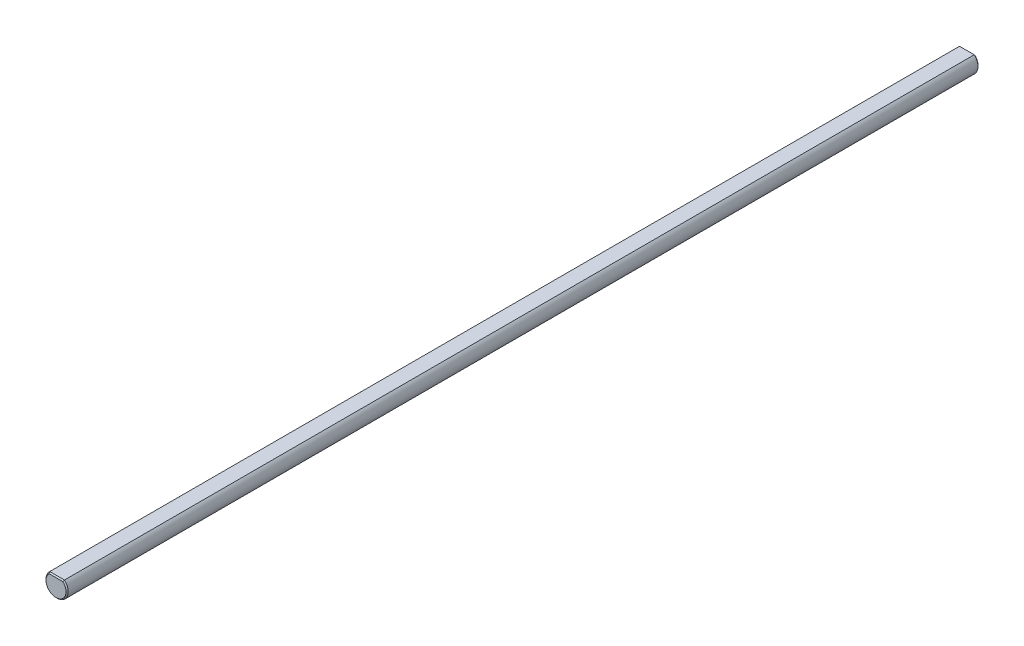
ISO-10303-21;
HEADER;
FILE_DESCRIPTION(('STEP AP214'),'2;1');
FILE_NAME('part.step','',(''),(''),'','','');
FILE_SCHEMA(('AUTOMOTIVE_DESIGN { 1 0 10303 214 1 1 1 1 }'));
ENDSEC;
DATA;
#1=APPLICATION_CONTEXT('core data for automotive mechanical design processes');
#2=APPLICATION_PROTOCOL_DEFINITION('international standard','automotive_design',2000,#1);
#3=PRODUCT_CONTEXT('',#1,'mechanical');
#4=PRODUCT('Part','Part','',(#3));
#5=PRODUCT_RELATED_PRODUCT_CATEGORY('part','',(#4));
#6=PRODUCT_DEFINITION_FORMATION('','',#4);
#7=PRODUCT_DEFINITION_CONTEXT('part definition',#1,'design');
#8=PRODUCT_DEFINITION('design','',#6,#7);
#9=PRODUCT_DEFINITION_SHAPE('','',#8);
#10=(LENGTH_UNIT() NAMED_UNIT(*) SI_UNIT(.MILLI.,.METRE.));
#11=(NAMED_UNIT(*) PLANE_ANGLE_UNIT() SI_UNIT($,.RADIAN.));
#12=(NAMED_UNIT(*) SI_UNIT($,.STERADIAN.) SOLID_ANGLE_UNIT());
#13=UNCERTAINTY_MEASURE_WITH_UNIT(LENGTH_MEASURE(1.E-05),#10,'distance_accuracy_value','');
#14=(GEOMETRIC_REPRESENTATION_CONTEXT(3) GLOBAL_UNCERTAINTY_ASSIGNED_CONTEXT((#13)) GLOBAL_UNIT_ASSIGNED_CONTEXT((#10,
#11,#12)) REPRESENTATION_CONTEXT('',''));
#15=CARTESIAN_POINT('',(0.,0.,0.));
#16=DIRECTION('',(0.,0.,1.));
#17=DIRECTION('',(1.,0.,0.));
#18=AXIS2_PLACEMENT_3D('',#15,#16,#17);
#19=CARTESIAN_POINT('',(0.,1.5,163.8));
#20=DIRECTION('',(0.,-0.707106781186499,-0.707106781186597));
#21=DIRECTION('',(0.,0.707106781186597,-0.707106781186499));
#22=AXIS2_PLACEMENT_3D('',#19,#20,#21);
#23=PLANE('',#22);
#24=CARTESIAN_POINT('',(-1.24498995977482,1.29999999997577,164.000000000024));
#25=CARTESIAN_POINT('',(-1.25833682017448,1.33326211364801,163.966737886352));
#26=CARTESIAN_POINT('',(-1.27150073002135,1.36655985039753,163.933440149603));
#27=CARTESIAN_POINT('',(-1.29746262802024,1.43322651718062,163.866773482819));
#28=CARTESIAN_POINT('',(-1.31026061675261,1.46659544710119,163.833404552899));
#29=CARTESIAN_POINT('',(-1.32287565551257,1.49999999998604,163.800000000014));
#30=B_SPLINE_CURVE_WITH_KNOTS('',3,(#24,#25,#26,#27,#28,#29),.UNSPECIFIED.,.F.,.F.,(4,2,4),(0.,
0.146686412491537,0.293372592321572),.UNSPECIFIED.);
#31=CARTESIAN_POINT('',(-1.24498995975276,1.30000000000002,164.000000000022));
#32=VERTEX_POINT('',#31);
#33=CARTESIAN_POINT('',(-1.32287565551942,1.49999999999428,163.800000000005));
#34=VERTEX_POINT('',#33);
#35=EDGE_CURVE('E62',#32,#34,#30,.T.);
#36=ORIENTED_EDGE('',*,*,#35,.F.);
#37=DIRECTION('',(1.,0.,0.));
#38=VECTOR('',#37,1.);
#39=CARTESIAN_POINT('',(0.,1.30000000000002,164.));
#40=LINE('',#39,#38);
#41=CARTESIAN_POINT('',(1.24498995974785,1.2999999999879,164.000000000034));
#42=VERTEX_POINT('',#41);
#43=EDGE_CURVE('E74',#42,#32,#40,.F.);
#44=ORIENTED_EDGE('',*,*,#43,.F.);
#45=CARTESIAN_POINT('',(1.32287565551256,1.49999999998752,163.800000000013));
#46=CARTESIAN_POINT('',(1.31026061675272,1.4665954471024,163.833404552898));
#47=CARTESIAN_POINT('',(1.29746262802044,1.43322651718157,163.866773482819));
#48=CARTESIAN_POINT('',(1.27150073002169,1.36655985039795,163.933440149602));
#49=CARTESIAN_POINT('',(1.25833682017486,1.33326211364817,163.966737886352));
#50=CARTESIAN_POINT('',(1.24498995977523,1.29999999997569,164.000000000024));
#51=B_SPLINE_CURVE_WITH_KNOTS('',3,(#45,#46,#47,#48,#49,#50),.UNSPECIFIED.,.F.,.F.,(4,2,4),(0.,
0.146686179831036,0.293372592323592),.UNSPECIFIED.);
#52=CARTESIAN_POINT('',(1.32287565551096,1.50000000000387,163.800000000004));
#53=VERTEX_POINT('',#52);
#54=EDGE_CURVE('E21',#53,#42,#51,.T.);
#55=ORIENTED_EDGE('',*,*,#54,.F.);
#56=DIRECTION('',(1.,0.,0.));
#57=VECTOR('',#56,1.);
#58=CARTESIAN_POINT('',(0.,1.5,163.799999999996));
#59=LINE('',#58,#57);
#60=EDGE_CURVE('E72',#34,#53,#59,.T.);
#61=ORIENTED_EDGE('',*,*,#60,.F.);
#62=EDGE_LOOP('',(#36,#44,#55,#61));
#63=FACE_BOUND('',#62,.T.);
#64=ADVANCED_FACE('F17',(#63),#23,.F.);
#65=CARTESIAN_POINT('',(0.,1.29999999999999,0.));
#66=DIRECTION('',(0.,0.707106781186548,-0.707106781186548));
#67=DIRECTION('',(0.,0.707106781186548,0.707106781186548));
#68=AXIS2_PLACEMENT_3D('',#65,#66,#67);
#69=PLANE('',#68);
#70=CARTESIAN_POINT('',(1.24498995966783,1.30000000007247,5.93277434558087E-11));
#71=CARTESIAN_POINT('',(1.25833682006216,1.3332621137352,0.033262113728633));
#72=CARTESIAN_POINT('',(1.27150072990421,1.36655985047622,0.0665598504740331));
#73=CARTESIAN_POINT('',(1.29746262789445,1.43322651724428,0.133226517246481));
#74=CARTESIAN_POINT('',(1.310260616623,1.46659544715833,0.166595447160525));
#75=CARTESIAN_POINT('',(1.32287565537962,1.50000000003765,0.200000000037659));
#76=B_SPLINE_CURVE_WITH_KNOTS('',3,(#70,#71,#72,#73,#74,#75),.UNSPECIFIED.,.F.,.F.,(4,2,4),(0.,
0.146686412461847,0.293372592262176),.UNSPECIFIED.);
#77=CARTESIAN_POINT('',(1.24498995972612,1.30000000004096,9.0040247803492E-11));
#78=VERTEX_POINT('',#77);
#79=CARTESIAN_POINT('',(1.32287565544856,1.5,0.200000000000006));
#80=VERTEX_POINT('',#79);
#81=EDGE_CURVE('E75',#78,#80,#76,.T.);
#82=ORIENTED_EDGE('',*,*,#81,.F.);
#83=DIRECTION('',(1.,0.,0.));
#84=VECTOR('',#83,1.);
#85=CARTESIAN_POINT('',(0.,1.30000000001553,0.));
#86=LINE('',#85,#84);
#87=CARTESIAN_POINT('',(-1.24498995972612,1.30000000004096,9.00401911849683E-11));
#88=VERTEX_POINT('',#87);
#89=EDGE_CURVE('E87',#78,#88,#86,.F.);
#90=ORIENTED_EDGE('',*,*,#89,.T.);
#91=CARTESIAN_POINT('',(-1.32287565538363,1.50000000004975,0.200000000020289));
#92=CARTESIAN_POINT('',(-1.31026061662512,1.46659544716483,0.166595447150098));
#93=CARTESIAN_POINT('',(-1.29746262789512,1.43322651724646,0.133226517241555));
#94=CARTESIAN_POINT('',(-1.27150072990287,1.3665598504723,0.0665598504772168));
#95=CARTESIAN_POINT('',(-1.25833682006025,1.33326211372951,0.0332621137344261));
#96=CARTESIAN_POINT('',(-1.24498995966579,1.30000000006628,6.62877115150832E-11));
#97=B_SPLINE_CURVE_WITH_KNOTS('',3,(#91,#92,#93,#94,#95,#96),.UNSPECIFIED.,.F.,.F.,(4,2,4),(0.,
0.146686179799054,0.293372592259652),.UNSPECIFIED.);
#98=CARTESIAN_POINT('',(-1.32287565545536,1.500000000018,0.200000000019685));
#99=VERTEX_POINT('',#98);
#100=EDGE_CURVE('E91',#99,#88,#97,.T.);
#101=ORIENTED_EDGE('',*,*,#100,.F.);
#102=DIRECTION('',(1.,0.,0.));
#103=VECTOR('',#102,1.);
#104=CARTESIAN_POINT('',(0.,1.5,0.200000000000006));
#105=LINE('',#104,#103);
#106=EDGE_CURVE('E82',#80,#99,#105,.F.);
#107=ORIENTED_EDGE('',*,*,#106,.F.);
#108=EDGE_LOOP('',(#82,#90,#101,#107));
#109=FACE_BOUND('',#108,.T.);
#110=ADVANCED_FACE('F110',(#109),#69,.T.);
#111=CARTESIAN_POINT('',(0.,0.,164.));
#112=DIRECTION('',(0.,0.,1.));
#113=DIRECTION('',(1.,0.,0.));
#114=AXIS2_PLACEMENT_3D('',#111,#112,#113);
#115=PLANE('',#114);
#116=ORIENTED_EDGE('',*,*,#43,.T.);
#117=CARTESIAN_POINT('',(0.,0.,164.000000000044));
#118=DIRECTION('',(0.,0.,-1.));
#119=DIRECTION('',(-1.,0.,0.));
#120=AXIS2_PLACEMENT_3D('',#117,#118,#119);
#121=CIRCLE('',#120,1.79999999994607);
#122=EDGE_CURVE('E86',#42,#32,#121,.T.);
#123=ORIENTED_EDGE('',*,*,#122,.F.);
#124=EDGE_LOOP('',(#116,#123));
#125=FACE_BOUND('',#124,.T.);
#126=ADVANCED_FACE('F114',(#125),#115,.T.);
#127=CARTESIAN_POINT('',(0.,1.5,164.));
#128=DIRECTION('',(0.,1.,0.));
#129=DIRECTION('',(0.,0.,1.));
#130=AXIS2_PLACEMENT_3D('',#127,#128,#129);
#131=PLANE('',#130);
#132=DIRECTION('',(0.,0.,-1.));
#133=VECTOR('',#132,1.);
#134=CARTESIAN_POINT('',(1.32287565550937,1.50000000002022,164.));
#135=LINE('',#134,#133);
#136=EDGE_CURVE('E80',#80,#53,#135,.F.);
#137=ORIENTED_EDGE('',*,*,#136,.F.);
#138=ORIENTED_EDGE('',*,*,#106,.T.);
#139=DIRECTION('',(0.,0.,-1.));
#140=VECTOR('',#139,1.);
#141=CARTESIAN_POINT('',(-1.3228756555268,1.50000000000484,164.));
#142=LINE('',#141,#140);
#143=EDGE_CURVE('E81',#34,#99,#142,.T.);
#144=ORIENTED_EDGE('',*,*,#143,.F.);
#145=ORIENTED_EDGE('',*,*,#60,.T.);
#146=EDGE_LOOP('',(#137,#138,#144,#145));
#147=FACE_BOUND('',#146,.T.);
#148=ADVANCED_FACE('F78',(#147),#131,.T.);
#149=CARTESIAN_POINT('',(0.,0.,0.));
#150=DIRECTION('',(0.,0.,1.));
#151=DIRECTION('',(1.,0.,0.));
#152=AXIS2_PLACEMENT_3D('',#149,#150,#151);
#153=PLANE('',#152);
#154=ORIENTED_EDGE('',*,*,#89,.F.);
#155=CARTESIAN_POINT('',(0.,0.,1.13686837721616E-10));
#156=DIRECTION('',(0.,0.,1.));
#157=DIRECTION('',(1.,0.,0.));
#158=AXIS2_PLACEMENT_3D('',#155,#156,#157);
#159=CIRCLE('',#158,1.80000000000291);
#160=EDGE_CURVE('E68',#88,#78,#159,.T.);
#161=ORIENTED_EDGE('',*,*,#160,.F.);
#162=EDGE_LOOP('',(#154,#161));
#163=FACE_BOUND('',#162,.T.);
#164=ADVANCED_FACE('F129',(#163),#153,.F.);
#165=CARTESIAN_POINT('',(0.,0.,163.800000000094));
#166=DIRECTION('',(0.,0.,-1.));
#167=DIRECTION('',(-1.,0.,0.));
#168=AXIS2_PLACEMENT_3D('',#165,#166,#167);
#169=CONICAL_SURFACE('',#168,1.99999999989586,0.785398163397448);
#170=ORIENTED_EDGE('',*,*,#122,.T.);
#171=ORIENTED_EDGE('',*,*,#35,.T.);
#172=CARTESIAN_POINT('',(0.,0.,163.8));
#173=DIRECTION('',(0.,0.,-1.));
#174=DIRECTION('',(-1.,0.,0.));
#175=AXIS2_PLACEMENT_3D('',#172,#173,#174);
#176=CIRCLE('',#175,2.);
#177=EDGE_CURVE('E31',#53,#34,#176,.T.);
#178=ORIENTED_EDGE('',*,*,#177,.F.);
#179=ORIENTED_EDGE('',*,*,#54,.T.);
#180=EDGE_LOOP('',(#170,#171,#178,#179));
#181=FACE_BOUND('',#180,.T.);
#182=ADVANCED_FACE('F59',(#181),#169,.T.);
#183=CARTESIAN_POINT('',(0.,0.,0.200000000063483));
#184=DIRECTION('',(0.,0.,1.));
#185=DIRECTION('',(1.,0.,0.));
#186=AXIS2_PLACEMENT_3D('',#183,#184,#185);
#187=CONICAL_SURFACE('',#186,1.99999999995271,0.785398163397448);
#188=ORIENTED_EDGE('',*,*,#160,.T.);
#189=ORIENTED_EDGE('',*,*,#81,.T.);
#190=CARTESIAN_POINT('',(0.,0.,0.200000000000006));
#191=DIRECTION('',(0.,0.,-1.));
#192=DIRECTION('',(-1.,0.,0.));
#193=AXIS2_PLACEMENT_3D('',#190,#191,#192);
#194=CIRCLE('',#193,2.);
#195=EDGE_CURVE('E10',#99,#80,#194,.F.);
#196=ORIENTED_EDGE('',*,*,#195,.F.);
#197=ORIENTED_EDGE('',*,*,#100,.T.);
#198=EDGE_LOOP('',(#188,#189,#196,#197));
#199=FACE_BOUND('',#198,.T.);
#200=ADVANCED_FACE('F107',(#199),#187,.T.);
#201=CARTESIAN_POINT('',(0.,0.,164.));
#202=DIRECTION('',(0.,0.,-1.));
#203=DIRECTION('',(-1.,0.,0.));
#204=AXIS2_PLACEMENT_3D('',#201,#202,#203);
#205=CYLINDRICAL_SURFACE('',#204,2.);
#206=ORIENTED_EDGE('',*,*,#177,.T.);
#207=ORIENTED_EDGE('',*,*,#143,.T.);
#208=ORIENTED_EDGE('',*,*,#195,.T.);
#209=ORIENTED_EDGE('',*,*,#136,.T.);
#210=EDGE_LOOP('',(#206,#207,#208,#209));
#211=FACE_BOUND('',#210,.T.);
#212=ADVANCED_FACE('F84',(#211),#205,.T.);
#213=CLOSED_SHELL('',(#64,#110,#126,#148,#164,#182,#200,#212));
#214=MANIFOLD_SOLID_BREP('B1',#213);
#215=ADVANCED_BREP_SHAPE_REPRESENTATION('',(#18,#214),#14);
#216=SHAPE_DEFINITION_REPRESENTATION(#9,#215);
ENDSEC;
END-ISO-10303-21;
